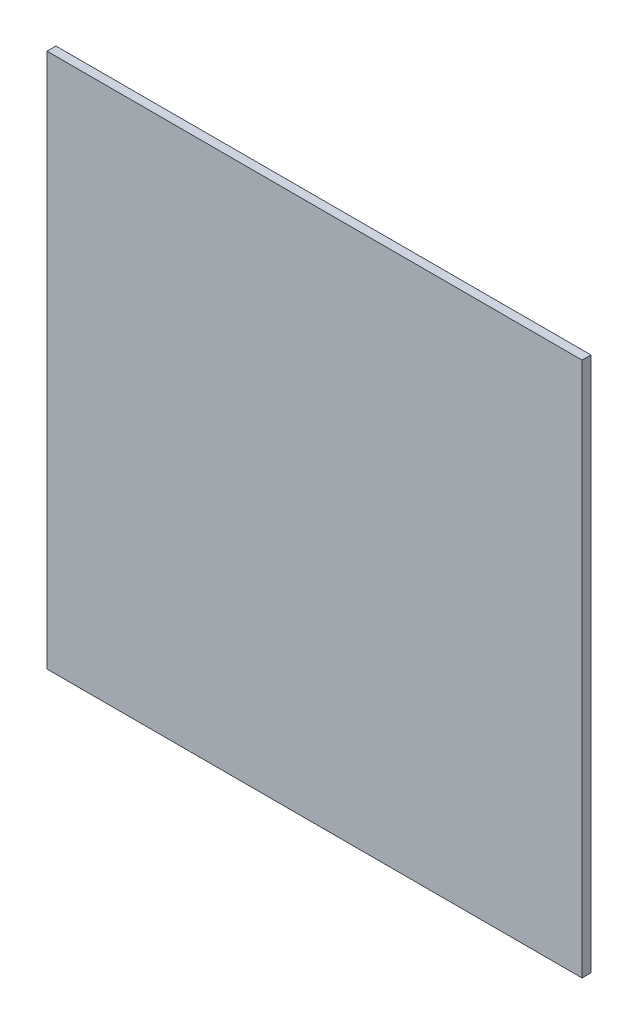
ISO-10303-21;
HEADER;
FILE_DESCRIPTION(('STEP AP214'),'2;1');
FILE_NAME('part.step','',(''),(''),'','','');
FILE_SCHEMA(('AUTOMOTIVE_DESIGN { 1 0 10303 214 1 1 1 1 }'));
ENDSEC;
DATA;
#1=APPLICATION_CONTEXT('core data for automotive mechanical design processes');
#2=APPLICATION_PROTOCOL_DEFINITION('international standard','automotive_design',2000,#1);
#3=PRODUCT_CONTEXT('',#1,'mechanical');
#4=PRODUCT('Part','Part','',(#3));
#5=PRODUCT_RELATED_PRODUCT_CATEGORY('part','',(#4));
#6=PRODUCT_DEFINITION_FORMATION('','',#4);
#7=PRODUCT_DEFINITION_CONTEXT('part definition',#1,'design');
#8=PRODUCT_DEFINITION('design','',#6,#7);
#9=PRODUCT_DEFINITION_SHAPE('','',#8);
#10=(LENGTH_UNIT() NAMED_UNIT(*) SI_UNIT(.MILLI.,.METRE.));
#11=(NAMED_UNIT(*) PLANE_ANGLE_UNIT() SI_UNIT($,.RADIAN.));
#12=(NAMED_UNIT(*) SI_UNIT($,.STERADIAN.) SOLID_ANGLE_UNIT());
#13=UNCERTAINTY_MEASURE_WITH_UNIT(LENGTH_MEASURE(1.E-05),#10,'distance_accuracy_value','');
#14=(GEOMETRIC_REPRESENTATION_CONTEXT(3) GLOBAL_UNCERTAINTY_ASSIGNED_CONTEXT((#13)) GLOBAL_UNIT_ASSIGNED_CONTEXT((#10,
#11,#12)) REPRESENTATION_CONTEXT('',''));
#15=CARTESIAN_POINT('',(0.,0.,0.));
#16=DIRECTION('',(0.,0.,1.));
#17=DIRECTION('',(1.,0.,0.));
#18=AXIS2_PLACEMENT_3D('',#15,#16,#17);
#19=CARTESIAN_POINT('',(-90.,-90.,3.));
#20=DIRECTION('',(1.,0.,0.));
#21=DIRECTION('',(0.,0.,-1.));
#22=AXIS2_PLACEMENT_3D('',#19,#20,#21);
#23=PLANE('',#22);
#24=DIRECTION('',(0.,-1.,0.));
#25=VECTOR('',#24,1.);
#26=CARTESIAN_POINT('',(-90.,-90.,0.));
#27=LINE('',#26,#25);
#28=CARTESIAN_POINT('',(-90.,90.,0.));
#29=VERTEX_POINT('',#28);
#30=CARTESIAN_POINT('',(-90.,-90.,0.));
#31=VERTEX_POINT('',#30);
#32=EDGE_CURVE('E109',#29,#31,#27,.T.);
#33=ORIENTED_EDGE('',*,*,#32,.T.);
#34=DIRECTION('',(0.,0.,-1.));
#35=VECTOR('',#34,1.);
#36=CARTESIAN_POINT('',(-90.,-90.,3.));
#37=LINE('',#36,#35);
#38=CARTESIAN_POINT('',(-90.,-90.,3.));
#39=VERTEX_POINT('',#38);
#40=EDGE_CURVE('E11',#39,#31,#37,.T.);
#41=ORIENTED_EDGE('',*,*,#40,.F.);
#42=DIRECTION('',(0.,-1.,0.));
#43=VECTOR('',#42,1.);
#44=CARTESIAN_POINT('',(-90.,-90.,3.));
#45=LINE('',#44,#43);
#46=CARTESIAN_POINT('',(-90.,90.,3.));
#47=VERTEX_POINT('',#46);
#48=EDGE_CURVE('E93',#47,#39,#45,.T.);
#49=ORIENTED_EDGE('',*,*,#48,.F.);
#50=DIRECTION('',(0.,0.,-1.));
#51=VECTOR('',#50,1.);
#52=CARTESIAN_POINT('',(-90.,90.,3.));
#53=LINE('',#52,#51);
#54=EDGE_CURVE('E105',#47,#29,#53,.T.);
#55=ORIENTED_EDGE('',*,*,#54,.T.);
#56=EDGE_LOOP('',(#33,#41,#49,#55));
#57=FACE_BOUND('',#56,.T.);
#58=ADVANCED_FACE('F41',(#57),#23,.F.);
#59=CARTESIAN_POINT('',(90.,-89.9999999999999,3.));
#60=DIRECTION('',(0.,1.,0.));
#61=DIRECTION('',(-1.,0.,0.));
#62=AXIS2_PLACEMENT_3D('',#59,#60,#61);
#63=PLANE('',#62);
#64=DIRECTION('',(1.,0.,0.));
#65=VECTOR('',#64,1.);
#66=CARTESIAN_POINT('',(90.,-89.9999999999999,0.));
#67=LINE('',#66,#65);
#68=CARTESIAN_POINT('',(90.,-89.9999999999999,0.));
#69=VERTEX_POINT('',#68);
#70=EDGE_CURVE('E98',#31,#69,#67,.T.);
#71=ORIENTED_EDGE('',*,*,#70,.T.);
#72=DIRECTION('',(0.,0.,-1.));
#73=VECTOR('',#72,1.);
#74=CARTESIAN_POINT('',(90.,-89.9999999999999,3.));
#75=LINE('',#74,#73);
#76=CARTESIAN_POINT('',(90.,-89.9999999999999,3.));
#77=VERTEX_POINT('',#76);
#78=EDGE_CURVE('E50',#77,#69,#75,.T.);
#79=ORIENTED_EDGE('',*,*,#78,.F.);
#80=DIRECTION('',(1.,0.,0.));
#81=VECTOR('',#80,1.);
#82=CARTESIAN_POINT('',(90.,-89.9999999999999,3.));
#83=LINE('',#82,#81);
#84=EDGE_CURVE('E88',#39,#77,#83,.T.);
#85=ORIENTED_EDGE('',*,*,#84,.F.);
#86=ORIENTED_EDGE('',*,*,#40,.T.);
#87=EDGE_LOOP('',(#71,#79,#85,#86));
#88=FACE_BOUND('',#87,.T.);
#89=ADVANCED_FACE('F97',(#88),#63,.F.);
#90=CARTESIAN_POINT('',(90.,-89.9999999999999,3.));
#91=DIRECTION('',(-1.,0.,0.));
#92=DIRECTION('',(0.,0.,1.));
#93=AXIS2_PLACEMENT_3D('',#90,#91,#92);
#94=PLANE('',#93);
#95=DIRECTION('',(0.,1.,0.));
#96=VECTOR('',#95,1.);
#97=CARTESIAN_POINT('',(90.,-89.9999999999999,0.));
#98=LINE('',#97,#96);
#99=CARTESIAN_POINT('',(90.,90.0000000000001,0.));
#100=VERTEX_POINT('',#99);
#101=EDGE_CURVE('E75',#69,#100,#98,.T.);
#102=ORIENTED_EDGE('',*,*,#101,.T.);
#103=DIRECTION('',(0.,0.,-1.));
#104=VECTOR('',#103,1.);
#105=CARTESIAN_POINT('',(90.,90.0000000000001,3.));
#106=LINE('',#105,#104);
#107=CARTESIAN_POINT('',(90.,90.0000000000001,3.));
#108=VERTEX_POINT('',#107);
#109=EDGE_CURVE('E100',#108,#100,#106,.T.);
#110=ORIENTED_EDGE('',*,*,#109,.F.);
#111=DIRECTION('',(0.,1.,0.));
#112=VECTOR('',#111,1.);
#113=CARTESIAN_POINT('',(90.,-89.9999999999999,3.));
#114=LINE('',#113,#112);
#115=EDGE_CURVE('E91',#77,#108,#114,.T.);
#116=ORIENTED_EDGE('',*,*,#115,.F.);
#117=ORIENTED_EDGE('',*,*,#78,.T.);
#118=EDGE_LOOP('',(#102,#110,#116,#117));
#119=FACE_BOUND('',#118,.T.);
#120=ADVANCED_FACE('F101',(#119),#94,.F.);
#121=CARTESIAN_POINT('',(90.,90.0000000000001,3.));
#122=DIRECTION('',(0.,-1.,0.));
#123=DIRECTION('',(1.,0.,0.));
#124=AXIS2_PLACEMENT_3D('',#121,#122,#123);
#125=PLANE('',#124);
#126=DIRECTION('',(-1.,0.,0.));
#127=VECTOR('',#126,1.);
#128=CARTESIAN_POINT('',(90.,90.0000000000001,0.));
#129=LINE('',#128,#127);
#130=EDGE_CURVE('E81',#100,#29,#129,.T.);
#131=ORIENTED_EDGE('',*,*,#130,.T.);
#132=ORIENTED_EDGE('',*,*,#54,.F.);
#133=DIRECTION('',(-1.,0.,0.));
#134=VECTOR('',#133,1.);
#135=CARTESIAN_POINT('',(90.,90.0000000000001,3.));
#136=LINE('',#135,#134);
#137=EDGE_CURVE('E58',#108,#47,#136,.T.);
#138=ORIENTED_EDGE('',*,*,#137,.F.);
#139=ORIENTED_EDGE('',*,*,#109,.T.);
#140=EDGE_LOOP('',(#131,#132,#138,#139));
#141=FACE_BOUND('',#140,.T.);
#142=ADVANCED_FACE('F122',(#141),#125,.F.);
#143=CARTESIAN_POINT('',(0.,0.,3.));
#144=DIRECTION('',(0.,0.,1.));
#145=DIRECTION('',(1.,0.,0.));
#146=AXIS2_PLACEMENT_3D('',#143,#144,#145);
#147=PLANE('',#146);
#148=ORIENTED_EDGE('',*,*,#48,.T.);
#149=ORIENTED_EDGE('',*,*,#84,.T.);
#150=ORIENTED_EDGE('',*,*,#115,.T.);
#151=ORIENTED_EDGE('',*,*,#137,.T.);
#152=EDGE_LOOP('',(#148,#149,#150,#151));
#153=FACE_BOUND('',#152,.T.);
#154=ADVANCED_FACE('F89',(#153),#147,.T.);
#155=CARTESIAN_POINT('',(0.,0.,0.));
#156=DIRECTION('',(0.,0.,1.));
#157=DIRECTION('',(1.,0.,0.));
#158=AXIS2_PLACEMENT_3D('',#155,#156,#157);
#159=PLANE('',#158);
#160=ORIENTED_EDGE('',*,*,#32,.F.);
#161=ORIENTED_EDGE('',*,*,#130,.F.);
#162=ORIENTED_EDGE('',*,*,#101,.F.);
#163=ORIENTED_EDGE('',*,*,#70,.F.);
#164=EDGE_LOOP('',(#160,#161,#162,#163));
#165=FACE_BOUND('',#164,.T.);
#166=ADVANCED_FACE('F125',(#165),#159,.F.);
#167=CLOSED_SHELL('',(#58,#89,#120,#142,#154,#166));
#168=MANIFOLD_SOLID_BREP('B2',#167);
#169=ADVANCED_BREP_SHAPE_REPRESENTATION('',(#18,#168),#14);
#170=SHAPE_DEFINITION_REPRESENTATION(#9,#169);
ENDSEC;
END-ISO-10303-21;
